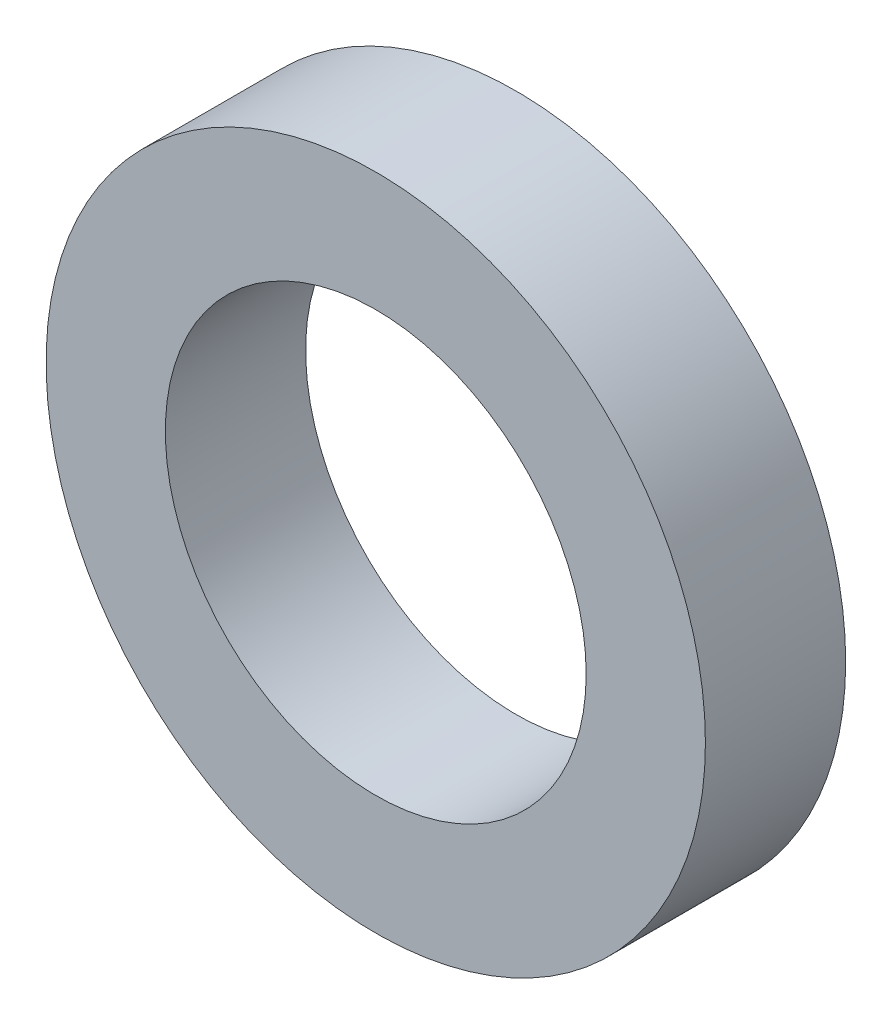
ISO-10303-21;
HEADER;
FILE_DESCRIPTION(('STEP AP214'),'2;1');
FILE_NAME('part.step','',(''),(''),'','','');
FILE_SCHEMA(('AUTOMOTIVE_DESIGN { 1 0 10303 214 1 1 1 1 }'));
ENDSEC;
DATA;
#1=APPLICATION_CONTEXT('core data for automotive mechanical design processes');
#2=APPLICATION_PROTOCOL_DEFINITION('international standard','automotive_design',2000,#1);
#3=PRODUCT_CONTEXT('',#1,'mechanical');
#4=PRODUCT('Part','Part','',(#3));
#5=PRODUCT_RELATED_PRODUCT_CATEGORY('part','',(#4));
#6=PRODUCT_DEFINITION_FORMATION('','',#4);
#7=PRODUCT_DEFINITION_CONTEXT('part definition',#1,'design');
#8=PRODUCT_DEFINITION('design','',#6,#7);
#9=PRODUCT_DEFINITION_SHAPE('','',#8);
#10=(LENGTH_UNIT() NAMED_UNIT(*) SI_UNIT(.MILLI.,.METRE.));
#11=(NAMED_UNIT(*) PLANE_ANGLE_UNIT() SI_UNIT($,.RADIAN.));
#12=(NAMED_UNIT(*) SI_UNIT($,.STERADIAN.) SOLID_ANGLE_UNIT());
#13=UNCERTAINTY_MEASURE_WITH_UNIT(LENGTH_MEASURE(1.E-05),#10,'distance_accuracy_value','');
#14=(GEOMETRIC_REPRESENTATION_CONTEXT(3) GLOBAL_UNCERTAINTY_ASSIGNED_CONTEXT((#13)) GLOBAL_UNIT_ASSIGNED_CONTEXT((#10,
#11,#12)) REPRESENTATION_CONTEXT('',''));
#15=CARTESIAN_POINT('',(0.,0.,0.));
#16=DIRECTION('',(0.,0.,1.));
#17=DIRECTION('',(1.,0.,0.));
#18=AXIS2_PLACEMENT_3D('',#15,#16,#17);
#19=CARTESIAN_POINT('',(0.,0.,1.));
#20=DIRECTION('',(0.,0.,1.));
#21=DIRECTION('',(1.,0.,0.));
#22=AXIS2_PLACEMENT_3D('',#19,#20,#21);
#23=PLANE('',#22);
#24=CARTESIAN_POINT('',(0.,0.,1.));
#25=DIRECTION('',(0.,0.,1.));
#26=DIRECTION('',(1.,0.,0.));
#27=AXIS2_PLACEMENT_3D('',#24,#25,#26);
#28=CIRCLE('',#27,2.35);
#29=CARTESIAN_POINT('',(2.35,0.,1.));
#30=VERTEX_POINT('',#29);
#31=EDGE_CURVE('E10',#30,#30,#28,.T.);
#32=ORIENTED_EDGE('',*,*,#31,.T.);
#33=EDGE_LOOP('',(#32));
#34=FACE_BOUND('',#33,.T.);
#35=CARTESIAN_POINT('',(0.,0.,1.));
#36=DIRECTION('',(0.,0.,1.));
#37=DIRECTION('',(1.,0.,0.));
#38=AXIS2_PLACEMENT_3D('',#35,#36,#37);
#39=CIRCLE('',#38,1.5);
#40=CARTESIAN_POINT('',(1.5,0.,1.));
#41=VERTEX_POINT('',#40);
#42=EDGE_CURVE('E56',#41,#41,#39,.T.);
#43=ORIENTED_EDGE('',*,*,#42,.F.);
#44=EDGE_LOOP('',(#43));
#45=FACE_BOUND('',#44,.T.);
#46=ADVANCED_FACE('F41',(#34,#45),#23,.T.);
#47=CARTESIAN_POINT('',(0.,0.,0.));
#48=DIRECTION('',(0.,0.,1.));
#49=DIRECTION('',(1.,0.,0.));
#50=AXIS2_PLACEMENT_3D('',#47,#48,#49);
#51=PLANE('',#50);
#52=CARTESIAN_POINT('',(0.,0.,0.));
#53=DIRECTION('',(0.,0.,1.));
#54=DIRECTION('',(1.,0.,0.));
#55=AXIS2_PLACEMENT_3D('',#52,#53,#54);
#56=CIRCLE('',#55,2.35);
#57=CARTESIAN_POINT('',(2.35,0.,0.));
#58=VERTEX_POINT('',#57);
#59=EDGE_CURVE('E45',#58,#58,#56,.T.);
#60=ORIENTED_EDGE('',*,*,#59,.F.);
#61=EDGE_LOOP('',(#60));
#62=FACE_BOUND('',#61,.T.);
#63=CARTESIAN_POINT('',(0.,0.,0.));
#64=DIRECTION('',(0.,0.,1.));
#65=DIRECTION('',(1.,0.,0.));
#66=AXIS2_PLACEMENT_3D('',#63,#64,#65);
#67=CIRCLE('',#66,1.5);
#68=CARTESIAN_POINT('',(1.5,0.,0.));
#69=VERTEX_POINT('',#68);
#70=EDGE_CURVE('E58',#69,#69,#67,.T.);
#71=ORIENTED_EDGE('',*,*,#70,.T.);
#72=EDGE_LOOP('',(#71));
#73=FACE_BOUND('',#72,.T.);
#74=ADVANCED_FACE('F68',(#62,#73),#51,.F.);
#75=CARTESIAN_POINT('',(0.,0.,1.));
#76=DIRECTION('',(0.,0.,-1.));
#77=DIRECTION('',(-1.,0.,0.));
#78=AXIS2_PLACEMENT_3D('',#75,#76,#77);
#79=CYLINDRICAL_SURFACE('',#78,2.35);
#80=ORIENTED_EDGE('',*,*,#31,.F.);
#81=EDGE_LOOP('',(#80));
#82=FACE_BOUND('',#81,.T.);
#83=ORIENTED_EDGE('',*,*,#59,.T.);
#84=EDGE_LOOP('',(#83));
#85=FACE_BOUND('',#84,.T.);
#86=ADVANCED_FACE('F43',(#82,#85),#79,.T.);
#87=CARTESIAN_POINT('',(0.,0.,1.));
#88=DIRECTION('',(0.,0.,-1.));
#89=DIRECTION('',(-1.,0.,0.));
#90=AXIS2_PLACEMENT_3D('',#87,#88,#89);
#91=CYLINDRICAL_SURFACE('',#90,1.5);
#92=ORIENTED_EDGE('',*,*,#42,.T.);
#93=EDGE_LOOP('',(#92));
#94=FACE_BOUND('',#93,.T.);
#95=ORIENTED_EDGE('',*,*,#70,.F.);
#96=EDGE_LOOP('',(#95));
#97=FACE_BOUND('',#96,.T.);
#98=ADVANCED_FACE('F64',(#94,#97),#91,.F.);
#99=CLOSED_SHELL('',(#46,#74,#86,#98));
#100=MANIFOLD_SOLID_BREP('B2',#99);
#101=ADVANCED_BREP_SHAPE_REPRESENTATION('',(#18,#100),#14);
#102=SHAPE_DEFINITION_REPRESENTATION(#9,#101);
ENDSEC;
END-ISO-10303-21;
